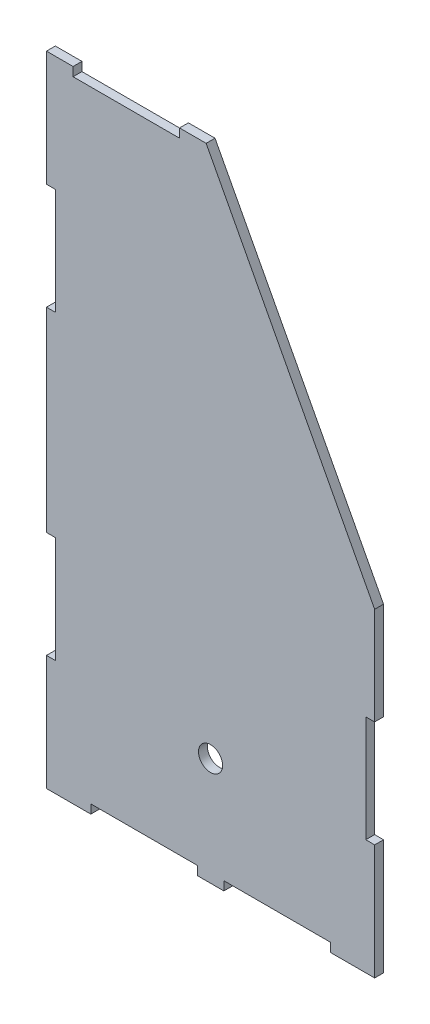
ISO-10303-21;
HEADER;
FILE_DESCRIPTION(('STEP AP214'),'2;1');
FILE_NAME('part.step','',(''),(''),'','','');
FILE_SCHEMA(('AUTOMOTIVE_DESIGN { 1 0 10303 214 1 1 1 1 }'));
ENDSEC;
DATA;
#1=APPLICATION_CONTEXT('core data for automotive mechanical design processes');
#2=APPLICATION_PROTOCOL_DEFINITION('international standard','automotive_design',2000,#1);
#3=PRODUCT_CONTEXT('',#1,'mechanical');
#4=PRODUCT('Part','Part','',(#3));
#5=PRODUCT_RELATED_PRODUCT_CATEGORY('part','',(#4));
#6=PRODUCT_DEFINITION_FORMATION('','',#4);
#7=PRODUCT_DEFINITION_CONTEXT('part definition',#1,'design');
#8=PRODUCT_DEFINITION('design','',#6,#7);
#9=PRODUCT_DEFINITION_SHAPE('','',#8);
#10=(LENGTH_UNIT() NAMED_UNIT(*) SI_UNIT(.MILLI.,.METRE.));
#11=(NAMED_UNIT(*) PLANE_ANGLE_UNIT() SI_UNIT($,.RADIAN.));
#12=(NAMED_UNIT(*) SI_UNIT($,.STERADIAN.) SOLID_ANGLE_UNIT());
#13=UNCERTAINTY_MEASURE_WITH_UNIT(LENGTH_MEASURE(1.E-05),#10,'distance_accuracy_value','');
#14=(GEOMETRIC_REPRESENTATION_CONTEXT(3) GLOBAL_UNCERTAINTY_ASSIGNED_CONTEXT((#13)) GLOBAL_UNIT_ASSIGNED_CONTEXT((#10,
#11,#12)) REPRESENTATION_CONTEXT('',''));
#15=CARTESIAN_POINT('',(0.,0.,0.));
#16=DIRECTION('',(0.,0.,1.));
#17=DIRECTION('',(1.,0.,0.));
#18=AXIS2_PLACEMENT_3D('',#15,#16,#17);
#19=CARTESIAN_POINT('',(321.219883672572,642.86985555023,6.35));
#20=DIRECTION('',(1.,0.,0.));
#21=DIRECTION('',(0.,0.,-1.));
#22=AXIS2_PLACEMENT_3D('',#19,#20,#21);
#23=PLANE('',#22);
#24=DIRECTION('',(0.,-1.,0.));
#25=VECTOR('',#24,1.);
#26=CARTESIAN_POINT('',(321.219883672572,642.86985555023,0.));
#27=LINE('',#26,#25);
#28=CARTESIAN_POINT('',(321.219883672572,484.11985555023,0.));
#29=VERTEX_POINT('',#28);
#30=CARTESIAN_POINT('',(321.219883672572,344.41985555023,0.));
#31=VERTEX_POINT('',#30);
#32=EDGE_CURVE('E249',#29,#31,#27,.T.);
#33=ORIENTED_EDGE('',*,*,#32,.T.);
#34=DIRECTION('',(0.,0.,1.));
#35=VECTOR('',#34,1.);
#36=CARTESIAN_POINT('',(321.219883672572,344.41985555023,0.));
#37=LINE('',#36,#35);
#38=CARTESIAN_POINT('',(321.219883672572,344.41985555023,6.35));
#39=VERTEX_POINT('',#38);
#40=EDGE_CURVE('E378',#31,#39,#37,.T.);
#41=ORIENTED_EDGE('',*,*,#40,.T.);
#42=DIRECTION('',(0.,-1.,0.));
#43=VECTOR('',#42,1.);
#44=CARTESIAN_POINT('',(321.219883672572,642.86985555023,6.35));
#45=LINE('',#44,#43);
#46=CARTESIAN_POINT('',(321.219883672572,484.11985555023,6.35));
#47=VERTEX_POINT('',#46);
#48=EDGE_CURVE('E414',#47,#39,#45,.T.);
#49=ORIENTED_EDGE('',*,*,#48,.F.);
#50=DIRECTION('',(0.,0.,1.));
#51=VECTOR('',#50,1.);
#52=CARTESIAN_POINT('',(321.219883672572,484.11985555023,0.));
#53=LINE('',#52,#51);
#54=EDGE_CURVE('E373',#29,#47,#53,.T.);
#55=ORIENTED_EDGE('',*,*,#54,.F.);
#56=EDGE_LOOP('',(#33,#41,#49,#55));
#57=FACE_BOUND('',#56,.T.);
#58=ADVANCED_FACE('F34',(#57),#23,.F.);
#59=CARTESIAN_POINT('',(321.219883672572,642.86985555023,0.));
#60=VERTEX_POINT('',#59);
#61=CARTESIAN_POINT('',(321.219883672572,560.31985555023,0.));
#62=VERTEX_POINT('',#61);
#63=EDGE_CURVE('E252',#60,#62,#27,.T.);
#64=ORIENTED_EDGE('',*,*,#63,.T.);
#65=DIRECTION('',(0.,0.,1.));
#66=VECTOR('',#65,1.);
#67=CARTESIAN_POINT('',(321.219883672572,560.31985555023,0.));
#68=LINE('',#67,#66);
#69=CARTESIAN_POINT('',(321.219883672572,560.31985555023,6.35));
#70=VERTEX_POINT('',#69);
#71=EDGE_CURVE('E349',#62,#70,#68,.T.);
#72=ORIENTED_EDGE('',*,*,#71,.T.);
#73=CARTESIAN_POINT('',(321.219883672572,642.86985555023,6.35));
#74=VERTEX_POINT('',#73);
#75=EDGE_CURVE('E410',#74,#70,#45,.T.);
#76=ORIENTED_EDGE('',*,*,#75,.F.);
#77=DIRECTION('',(0.,0.,-1.));
#78=VECTOR('',#77,1.);
#79=CARTESIAN_POINT('',(321.219883672572,642.86985555023,6.35));
#80=LINE('',#79,#78);
#81=EDGE_CURVE('E288',#74,#60,#80,.T.);
#82=ORIENTED_EDGE('',*,*,#81,.T.);
#83=EDGE_LOOP('',(#64,#72,#76,#82));
#84=FACE_BOUND('',#83,.T.);
#85=ADVANCED_FACE('F439',(#84),#23,.F.);
#86=CARTESIAN_POINT('',(321.219883672572,185.66985555023,6.35));
#87=DIRECTION('',(0.,1.,0.));
#88=DIRECTION('',(-1.,0.,0.));
#89=AXIS2_PLACEMENT_3D('',#86,#87,#88);
#90=PLANE('',#89);
#91=DIRECTION('',(1.,0.,0.));
#92=VECTOR('',#91,1.);
#93=CARTESIAN_POINT('',(321.219883672572,185.66985555023,0.));
#94=LINE('',#93,#92);
#95=CARTESIAN_POINT('',(321.219883672572,185.66985555023,0.));
#96=VERTEX_POINT('',#95);
#97=CARTESIAN_POINT('',(352.969883672572,185.66985555023,0.));
#98=VERTEX_POINT('',#97);
#99=EDGE_CURVE('E248',#96,#98,#94,.T.);
#100=ORIENTED_EDGE('',*,*,#99,.T.);
#101=DIRECTION('',(0.,0.,1.));
#102=VECTOR('',#101,1.);
#103=CARTESIAN_POINT('',(352.969883672572,185.66985555023,0.));
#104=LINE('',#103,#102);
#105=CARTESIAN_POINT('',(352.969883672572,185.66985555023,6.35));
#106=VERTEX_POINT('',#105);
#107=EDGE_CURVE('E462',#98,#106,#104,.T.);
#108=ORIENTED_EDGE('',*,*,#107,.T.);
#109=DIRECTION('',(1.,0.,0.));
#110=VECTOR('',#109,1.);
#111=CARTESIAN_POINT('',(321.219883672572,185.66985555023,6.35));
#112=LINE('',#111,#110);
#113=CARTESIAN_POINT('',(321.219883672572,185.66985555023,6.35));
#114=VERTEX_POINT('',#113);
#115=EDGE_CURVE('E415',#114,#106,#112,.T.);
#116=ORIENTED_EDGE('',*,*,#115,.F.);
#117=DIRECTION('',(0.,0.,-1.));
#118=VECTOR('',#117,1.);
#119=CARTESIAN_POINT('',(321.219883672572,185.66985555023,6.35));
#120=LINE('',#119,#118);
#121=EDGE_CURVE('E11',#114,#96,#120,.T.);
#122=ORIENTED_EDGE('',*,*,#121,.T.);
#123=EDGE_LOOP('',(#100,#108,#116,#122));
#124=FACE_BOUND('',#123,.T.);
#125=ADVANCED_FACE('F461',(#124),#90,.F.);
#126=CARTESIAN_POINT('',(429.169883672572,185.66985555023,6.35));
#127=VERTEX_POINT('',#126);
#128=CARTESIAN_POINT('',(448.219883672572,185.66985555023,6.35));
#129=VERTEX_POINT('',#128);
#130=EDGE_CURVE('E419',#127,#129,#112,.T.);
#131=ORIENTED_EDGE('',*,*,#130,.F.);
#132=DIRECTION('',(0.,0.,1.));
#133=VECTOR('',#132,1.);
#134=CARTESIAN_POINT('',(429.169883672572,185.66985555023,0.));
#135=LINE('',#134,#133);
#136=CARTESIAN_POINT('',(429.169883672572,185.66985555023,0.));
#137=VERTEX_POINT('',#136);
#138=EDGE_CURVE('E465',#137,#127,#135,.T.);
#139=ORIENTED_EDGE('',*,*,#138,.F.);
#140=CARTESIAN_POINT('',(448.219883672572,185.66985555023,0.));
#141=VERTEX_POINT('',#140);
#142=EDGE_CURVE('E264',#137,#141,#94,.T.);
#143=ORIENTED_EDGE('',*,*,#142,.T.);
#144=DIRECTION('',(0.,0.,1.));
#145=VECTOR('',#144,1.);
#146=CARTESIAN_POINT('',(448.219883672572,185.66985555023,0.));
#147=LINE('',#146,#145);
#148=EDGE_CURVE('E345',#141,#129,#147,.T.);
#149=ORIENTED_EDGE('',*,*,#148,.T.);
#150=EDGE_LOOP('',(#131,#139,#143,#149));
#151=FACE_BOUND('',#150,.T.);
#152=ADVANCED_FACE('F526',(#151),#90,.F.);
#153=CARTESIAN_POINT('',(556.169883672572,414.26985555023,6.35));
#154=DIRECTION('',(-1.,0.,0.));
#155=DIRECTION('',(0.,-1.,0.));
#156=AXIS2_PLACEMENT_3D('',#153,#154,#155);
#157=PLANE('',#156);
#158=DIRECTION('',(0.,1.,0.));
#159=VECTOR('',#158,1.);
#160=CARTESIAN_POINT('',(556.169883672572,414.26985555023,6.35));
#161=LINE('',#160,#159);
#162=CARTESIAN_POINT('',(556.169883672572,344.41985555023,6.35));
#163=VERTEX_POINT('',#162);
#164=CARTESIAN_POINT('',(556.169883672572,414.26985555023,6.35));
#165=VERTEX_POINT('',#164);
#166=EDGE_CURVE('E418',#163,#165,#161,.T.);
#167=ORIENTED_EDGE('',*,*,#166,.F.);
#168=DIRECTION('',(0.,0.,1.));
#169=VECTOR('',#168,1.);
#170=CARTESIAN_POINT('',(556.169883672572,344.41985555023,0.));
#171=LINE('',#170,#169);
#172=CARTESIAN_POINT('',(556.169883672572,344.41985555023,0.));
#173=VERTEX_POINT('',#172);
#174=EDGE_CURVE('E331',#173,#163,#171,.T.);
#175=ORIENTED_EDGE('',*,*,#174,.F.);
#176=DIRECTION('',(0.,1.,0.));
#177=VECTOR('',#176,1.);
#178=CARTESIAN_POINT('',(556.169883672572,414.26985555023,0.));
#179=LINE('',#178,#177);
#180=CARTESIAN_POINT('',(556.169883672572,414.26985555023,0.));
#181=VERTEX_POINT('',#180);
#182=EDGE_CURVE('E272',#173,#181,#179,.T.);
#183=ORIENTED_EDGE('',*,*,#182,.T.);
#184=DIRECTION('',(0.,0.,-1.));
#185=VECTOR('',#184,1.);
#186=CARTESIAN_POINT('',(556.169883672572,414.26985555023,6.35));
#187=LINE('',#186,#185);
#188=EDGE_CURVE('E294',#165,#181,#187,.T.);
#189=ORIENTED_EDGE('',*,*,#188,.F.);
#190=EDGE_LOOP('',(#167,#175,#183,#189));
#191=FACE_BOUND('',#190,.T.);
#192=ADVANCED_FACE('F527',(#191),#157,.F.);
#193=CARTESIAN_POINT('',(321.219883672572,642.86985555023,6.35));
#194=DIRECTION('',(0.,-1.,0.));
#195=DIRECTION('',(0.,0.,-1.));
#196=AXIS2_PLACEMENT_3D('',#193,#194,#195);
#197=PLANE('',#196);
#198=DIRECTION('',(-1.,0.,0.));
#199=VECTOR('',#198,1.);
#200=CARTESIAN_POINT('',(321.219883672572,642.86985555023,0.));
#201=LINE('',#200,#199);
#202=CARTESIAN_POINT('',(435.519883672572,642.86985555023,0.));
#203=VERTEX_POINT('',#202);
#204=CARTESIAN_POINT('',(416.469883672572,642.86985555023,0.));
#205=VERTEX_POINT('',#204);
#206=EDGE_CURVE('E285',#203,#205,#201,.T.);
#207=ORIENTED_EDGE('',*,*,#206,.T.);
#208=DIRECTION('',(0.,0.,1.));
#209=VECTOR('',#208,1.);
#210=CARTESIAN_POINT('',(416.469883672572,642.86985555023,0.));
#211=LINE('',#210,#209);
#212=CARTESIAN_POINT('',(416.469883672572,642.86985555023,6.35));
#213=VERTEX_POINT('',#212);
#214=EDGE_CURVE('E398',#205,#213,#211,.T.);
#215=ORIENTED_EDGE('',*,*,#214,.T.);
#216=DIRECTION('',(-1.,0.,0.));
#217=VECTOR('',#216,1.);
#218=CARTESIAN_POINT('',(321.219883672572,642.86985555023,6.35));
#219=LINE('',#218,#217);
#220=CARTESIAN_POINT('',(435.519883672572,642.86985555023,6.35));
#221=VERTEX_POINT('',#220);
#222=EDGE_CURVE('E291',#221,#213,#219,.T.);
#223=ORIENTED_EDGE('',*,*,#222,.F.);
#224=DIRECTION('',(0.,0.,-1.));
#225=VECTOR('',#224,1.);
#226=CARTESIAN_POINT('',(435.519883672572,642.86985555023,6.35));
#227=LINE('',#226,#225);
#228=EDGE_CURVE('E290',#221,#203,#227,.T.);
#229=ORIENTED_EDGE('',*,*,#228,.T.);
#230=EDGE_LOOP('',(#207,#215,#223,#229));
#231=FACE_BOUND('',#230,.T.);
#232=ADVANCED_FACE('F521',(#231),#197,.F.);
#233=CARTESIAN_POINT('',(321.219883672572,268.21985555023,6.35));
#234=VERTEX_POINT('',#233);
#235=EDGE_CURVE('E241',#234,#114,#45,.T.);
#236=ORIENTED_EDGE('',*,*,#235,.F.);
#237=DIRECTION('',(0.,0.,1.));
#238=VECTOR('',#237,1.);
#239=CARTESIAN_POINT('',(321.219883672572,268.21985555023,0.));
#240=LINE('',#239,#238);
#241=CARTESIAN_POINT('',(321.219883672572,268.21985555023,0.));
#242=VERTEX_POINT('',#241);
#243=EDGE_CURVE('E229',#242,#234,#240,.T.);
#244=ORIENTED_EDGE('',*,*,#243,.F.);
#245=EDGE_CURVE('E239',#242,#96,#27,.T.);
#246=ORIENTED_EDGE('',*,*,#245,.T.);
#247=ORIENTED_EDGE('',*,*,#121,.F.);
#248=EDGE_LOOP('',(#236,#244,#246,#247));
#249=FACE_BOUND('',#248,.T.);
#250=ADVANCED_FACE('F36',(#249),#23,.F.);
#251=CARTESIAN_POINT('',(524.419883672572,185.66985555023,6.35));
#252=VERTEX_POINT('',#251);
#253=CARTESIAN_POINT('',(556.169883672572,185.66985555023,6.35));
#254=VERTEX_POINT('',#253);
#255=EDGE_CURVE('E413',#252,#254,#112,.T.);
#256=ORIENTED_EDGE('',*,*,#255,.F.);
#257=DIRECTION('',(0.,0.,1.));
#258=VECTOR('',#257,1.);
#259=CARTESIAN_POINT('',(524.419883672572,185.66985555023,0.));
#260=LINE('',#259,#258);
#261=CARTESIAN_POINT('',(524.419883672572,185.66985555023,0.));
#262=VERTEX_POINT('',#261);
#263=EDGE_CURVE('E359',#262,#252,#260,.T.);
#264=ORIENTED_EDGE('',*,*,#263,.F.);
#265=CARTESIAN_POINT('',(556.169883672572,185.66985555023,0.));
#266=VERTEX_POINT('',#265);
#267=EDGE_CURVE('E259',#262,#266,#94,.T.);
#268=ORIENTED_EDGE('',*,*,#267,.T.);
#269=DIRECTION('',(0.,0.,-1.));
#270=VECTOR('',#269,1.);
#271=CARTESIAN_POINT('',(556.169883672572,185.66985555023,6.35));
#272=LINE('',#271,#270);
#273=EDGE_CURVE('E43',#254,#266,#272,.T.);
#274=ORIENTED_EDGE('',*,*,#273,.F.);
#275=EDGE_LOOP('',(#256,#264,#268,#274));
#276=FACE_BOUND('',#275,.T.);
#277=ADVANCED_FACE('F520',(#276),#90,.F.);
#278=CARTESIAN_POINT('',(556.169883672572,268.21985555023,0.));
#279=VERTEX_POINT('',#278);
#280=EDGE_CURVE('E275',#266,#279,#179,.T.);
#281=ORIENTED_EDGE('',*,*,#280,.T.);
#282=DIRECTION('',(0.,0.,1.));
#283=VECTOR('',#282,1.);
#284=CARTESIAN_POINT('',(556.169883672572,268.21985555023,0.));
#285=LINE('',#284,#283);
#286=CARTESIAN_POINT('',(556.169883672572,268.21985555023,6.35));
#287=VERTEX_POINT('',#286);
#288=EDGE_CURVE('E333',#279,#287,#285,.T.);
#289=ORIENTED_EDGE('',*,*,#288,.T.);
#290=EDGE_CURVE('E302',#254,#287,#161,.T.);
#291=ORIENTED_EDGE('',*,*,#290,.F.);
#292=ORIENTED_EDGE('',*,*,#273,.T.);
#293=EDGE_LOOP('',(#281,#289,#291,#292));
#294=FACE_BOUND('',#293,.T.);
#295=ADVANCED_FACE('F299',(#294),#157,.F.);
#296=CARTESIAN_POINT('',(435.519883672572,642.86985555023,6.35));
#297=DIRECTION('',(-0.884384752846969,-0.466758619558123,0.));
#298=DIRECTION('',(0.466758619558123,-0.884384752846969,0.));
#299=AXIS2_PLACEMENT_3D('',#296,#297,#298);
#300=PLANE('',#299);
#301=DIRECTION('',(-0.466758619558123,0.884384752846969,0.));
#302=VECTOR('',#301,1.);
#303=CARTESIAN_POINT('',(435.519883672572,642.86985555023,0.));
#304=LINE('',#303,#302);
#305=EDGE_CURVE('E281',#181,#203,#304,.T.);
#306=ORIENTED_EDGE('',*,*,#305,.T.);
#307=ORIENTED_EDGE('',*,*,#228,.F.);
#308=DIRECTION('',(-0.466758619558123,0.884384752846969,0.));
#309=VECTOR('',#308,1.);
#310=CARTESIAN_POINT('',(435.519883672572,642.86985555023,6.35));
#311=LINE('',#310,#309);
#312=EDGE_CURVE('E421',#165,#221,#311,.T.);
#313=ORIENTED_EDGE('',*,*,#312,.F.);
#314=ORIENTED_EDGE('',*,*,#188,.T.);
#315=EDGE_LOOP('',(#306,#307,#313,#314));
#316=FACE_BOUND('',#315,.T.);
#317=ADVANCED_FACE('F537',(#316),#300,.F.);
#318=CARTESIAN_POINT('',(340.269883672572,642.86985555023,6.35));
#319=VERTEX_POINT('',#318);
#320=EDGE_CURVE('E422',#319,#74,#219,.T.);
#321=ORIENTED_EDGE('',*,*,#320,.F.);
#322=DIRECTION('',(0.,0.,1.));
#323=VECTOR('',#322,1.);
#324=CARTESIAN_POINT('',(340.269883672572,642.86985555023,0.));
#325=LINE('',#324,#323);
#326=CARTESIAN_POINT('',(340.269883672572,642.86985555023,0.));
#327=VERTEX_POINT('',#326);
#328=EDGE_CURVE('E406',#327,#319,#325,.T.);
#329=ORIENTED_EDGE('',*,*,#328,.F.);
#330=EDGE_CURVE('E284',#327,#60,#201,.T.);
#331=ORIENTED_EDGE('',*,*,#330,.T.);
#332=ORIENTED_EDGE('',*,*,#81,.F.);
#333=EDGE_LOOP('',(#321,#329,#331,#332));
#334=FACE_BOUND('',#333,.T.);
#335=ADVANCED_FACE('F437',(#334),#197,.F.);
#336=CARTESIAN_POINT('',(0.,0.,6.35));
#337=DIRECTION('',(0.,0.,1.));
#338=DIRECTION('',(1.,0.,0.));
#339=AXIS2_PLACEMENT_3D('',#336,#337,#338);
#340=PLANE('',#339);
#341=CARTESIAN_POINT('',(438.694883672572,262.989065336249,6.35));
#342=DIRECTION('',(0.,0.,1.));
#343=DIRECTION('',(1.,0.,0.));
#344=AXIS2_PLACEMENT_3D('',#341,#342,#343);
#345=CIRCLE('',#344,8.63599999999998);
#346=CARTESIAN_POINT('',(447.330883672572,262.989065336249,6.35));
#347=VERTEX_POINT('',#346);
#348=EDGE_CURVE('E497',#347,#347,#345,.T.);
#349=ORIENTED_EDGE('',*,*,#348,.F.);
#350=EDGE_LOOP('',(#349));
#351=FACE_BOUND('',#350,.T.);
#352=DIRECTION('',(-1.,0.,0.));
#353=VECTOR('',#352,1.);
#354=CARTESIAN_POINT('',(549.819883672572,344.41985555023,6.35));
#355=LINE('',#354,#353);
#356=CARTESIAN_POINT('',(549.819883672572,344.41985555023,6.35));
#357=VERTEX_POINT('',#356);
#358=EDGE_CURVE('E317',#163,#357,#355,.T.);
#359=ORIENTED_EDGE('',*,*,#358,.F.);
#360=ORIENTED_EDGE('',*,*,#166,.T.);
#361=ORIENTED_EDGE('',*,*,#312,.T.);
#362=ORIENTED_EDGE('',*,*,#222,.T.);
#363=DIRECTION('',(0.,1.,0.));
#364=VECTOR('',#363,1.);
#365=CARTESIAN_POINT('',(416.469883672572,642.86985555023,6.35));
#366=LINE('',#365,#364);
#367=CARTESIAN_POINT('',(416.469883672572,636.51985555023,6.35));
#368=VERTEX_POINT('',#367);
#369=EDGE_CURVE('E356',#368,#213,#366,.T.);
#370=ORIENTED_EDGE('',*,*,#369,.F.);
#371=DIRECTION('',(1.,0.,0.));
#372=VECTOR('',#371,1.);
#373=CARTESIAN_POINT('',(416.469883672572,636.51985555023,6.35));
#374=LINE('',#373,#372);
#375=CARTESIAN_POINT('',(340.269883672572,636.51985555023,6.35));
#376=VERTEX_POINT('',#375);
#377=EDGE_CURVE('E392',#376,#368,#374,.T.);
#378=ORIENTED_EDGE('',*,*,#377,.F.);
#379=DIRECTION('',(0.,-1.,0.));
#380=VECTOR('',#379,1.);
#381=CARTESIAN_POINT('',(340.269883672572,642.86985555023,6.35));
#382=LINE('',#381,#380);
#383=EDGE_CURVE('E400',#319,#376,#382,.T.);
#384=ORIENTED_EDGE('',*,*,#383,.F.);
#385=ORIENTED_EDGE('',*,*,#320,.T.);
#386=ORIENTED_EDGE('',*,*,#75,.T.);
#387=DIRECTION('',(-1.,0.,0.));
#388=VECTOR('',#387,1.);
#389=CARTESIAN_POINT('',(321.219883672572,560.31985555023,6.35));
#390=LINE('',#389,#388);
#391=CARTESIAN_POINT('',(327.569883672572,560.31985555023,6.35));
#392=VERTEX_POINT('',#391);
#393=EDGE_CURVE('E367',#392,#70,#390,.T.);
#394=ORIENTED_EDGE('',*,*,#393,.F.);
#395=DIRECTION('',(0.,1.,0.));
#396=VECTOR('',#395,1.);
#397=CARTESIAN_POINT('',(327.569883672572,560.31985555023,6.35));
#398=LINE('',#397,#396);
#399=CARTESIAN_POINT('',(327.569883672572,484.11985555023,6.35));
#400=VERTEX_POINT('',#399);
#401=EDGE_CURVE('E377',#400,#392,#398,.T.);
#402=ORIENTED_EDGE('',*,*,#401,.F.);
#403=DIRECTION('',(1.,0.,0.));
#404=VECTOR('',#403,1.);
#405=CARTESIAN_POINT('',(321.219883672572,484.11985555023,6.35));
#406=LINE('',#405,#404);
#407=EDGE_CURVE('E374',#47,#400,#406,.T.);
#408=ORIENTED_EDGE('',*,*,#407,.F.);
#409=ORIENTED_EDGE('',*,*,#48,.T.);
#410=DIRECTION('',(-1.,0.,0.));
#411=VECTOR('',#410,1.);
#412=CARTESIAN_POINT('',(321.219883672572,344.41985555023,6.35));
#413=LINE('',#412,#411);
#414=CARTESIAN_POINT('',(327.569883672572,344.41985555023,6.35));
#415=VERTEX_POINT('',#414);
#416=EDGE_CURVE('E234',#415,#39,#413,.T.);
#417=ORIENTED_EDGE('',*,*,#416,.F.);
#418=DIRECTION('',(0.,1.,0.));
#419=VECTOR('',#418,1.);
#420=CARTESIAN_POINT('',(327.569883672572,344.41985555023,6.35));
#421=LINE('',#420,#419);
#422=CARTESIAN_POINT('',(327.569883672572,268.21985555023,6.35));
#423=VERTEX_POINT('',#422);
#424=EDGE_CURVE('E490',#423,#415,#421,.T.);
#425=ORIENTED_EDGE('',*,*,#424,.F.);
#426=DIRECTION('',(1.,0.,0.));
#427=VECTOR('',#426,1.);
#428=CARTESIAN_POINT('',(321.219883672572,268.21985555023,6.35));
#429=LINE('',#428,#427);
#430=EDGE_CURVE('E460',#234,#423,#429,.T.);
#431=ORIENTED_EDGE('',*,*,#430,.F.);
#432=ORIENTED_EDGE('',*,*,#235,.T.);
#433=ORIENTED_EDGE('',*,*,#115,.T.);
#434=DIRECTION('',(0.,-1.,0.));
#435=VECTOR('',#434,1.);
#436=CARTESIAN_POINT('',(352.969883672572,192.01985555023,6.35));
#437=LINE('',#436,#435);
#438=CARTESIAN_POINT('',(352.969883672572,192.01985555023,6.35));
#439=VERTEX_POINT('',#438);
#440=EDGE_CURVE('E330',#439,#106,#437,.T.);
#441=ORIENTED_EDGE('',*,*,#440,.F.);
#442=DIRECTION('',(-1.,0.,0.));
#443=VECTOR('',#442,1.);
#444=CARTESIAN_POINT('',(352.969883672572,192.01985555023,6.35));
#445=LINE('',#444,#443);
#446=CARTESIAN_POINT('',(429.169883672572,192.01985555023,6.35));
#447=VERTEX_POINT('',#446);
#448=EDGE_CURVE('E474',#447,#439,#445,.T.);
#449=ORIENTED_EDGE('',*,*,#448,.F.);
#450=DIRECTION('',(0.,1.,0.));
#451=VECTOR('',#450,1.);
#452=CARTESIAN_POINT('',(429.169883672572,192.01985555023,6.35));
#453=LINE('',#452,#451);
#454=EDGE_CURVE('E478',#127,#447,#453,.T.);
#455=ORIENTED_EDGE('',*,*,#454,.F.);
#456=ORIENTED_EDGE('',*,*,#130,.T.);
#457=DIRECTION('',(0.,-1.,0.));
#458=VECTOR('',#457,1.);
#459=CARTESIAN_POINT('',(448.219883672572,192.01985555023,6.35));
#460=LINE('',#459,#458);
#461=CARTESIAN_POINT('',(448.219883672572,192.01985555023,6.35));
#462=VERTEX_POINT('',#461);
#463=EDGE_CURVE('E346',#462,#129,#460,.T.);
#464=ORIENTED_EDGE('',*,*,#463,.F.);
#465=DIRECTION('',(-1.,0.,0.));
#466=VECTOR('',#465,1.);
#467=CARTESIAN_POINT('',(448.219883672572,192.01985555023,6.35));
#468=LINE('',#467,#466);
#469=CARTESIAN_POINT('',(524.419883672572,192.01985555023,6.35));
#470=VERTEX_POINT('',#469);
#471=EDGE_CURVE('E340',#470,#462,#468,.T.);
#472=ORIENTED_EDGE('',*,*,#471,.F.);
#473=DIRECTION('',(0.,1.,0.));
#474=VECTOR('',#473,1.);
#475=CARTESIAN_POINT('',(524.419883672572,192.01985555023,6.35));
#476=LINE('',#475,#474);
#477=EDGE_CURVE('E348',#252,#470,#476,.T.);
#478=ORIENTED_EDGE('',*,*,#477,.F.);
#479=ORIENTED_EDGE('',*,*,#255,.T.);
#480=ORIENTED_EDGE('',*,*,#290,.T.);
#481=DIRECTION('',(1.,0.,0.));
#482=VECTOR('',#481,1.);
#483=CARTESIAN_POINT('',(549.819883672572,268.21985555023,6.35));
#484=LINE('',#483,#482);
#485=CARTESIAN_POINT('',(549.819883672572,268.21985555023,6.35));
#486=VERTEX_POINT('',#485);
#487=EDGE_CURVE('E324',#486,#287,#484,.T.);
#488=ORIENTED_EDGE('',*,*,#487,.F.);
#489=DIRECTION('',(0.,-1.,0.));
#490=VECTOR('',#489,1.);
#491=CARTESIAN_POINT('',(549.819883672572,344.41985555023,6.35));
#492=LINE('',#491,#490);
#493=EDGE_CURVE('E321',#357,#486,#492,.T.);
#494=ORIENTED_EDGE('',*,*,#493,.F.);
#495=EDGE_LOOP('',(#359,#360,#361,#362,#370,#378,#384,#385,#386,#394,#402,#408,#409,#417,#425,
#431,#432,#433,#441,#449,#455,#456,#464,#472,#478,#479,#480,#488,#494));
#496=FACE_BOUND('',#495,.T.);
#497=ADVANCED_FACE('F431',(#351,#496),#340,.T.);
#498=CARTESIAN_POINT('',(0.,0.,0.));
#499=DIRECTION('',(0.,0.,1.));
#500=DIRECTION('',(1.,0.,0.));
#501=AXIS2_PLACEMENT_3D('',#498,#499,#500);
#502=PLANE('',#501);
#503=CARTESIAN_POINT('',(438.694883672572,262.989065336249,0.));
#504=DIRECTION('',(0.,0.,1.));
#505=DIRECTION('',(1.,0.,0.));
#506=AXIS2_PLACEMENT_3D('',#503,#504,#505);
#507=CIRCLE('',#506,8.63599999999998);
#508=CARTESIAN_POINT('',(447.330883672572,262.989065336249,0.));
#509=VERTEX_POINT('',#508);
#510=EDGE_CURVE('E38',#509,#509,#507,.T.);
#511=ORIENTED_EDGE('',*,*,#510,.T.);
#512=EDGE_LOOP('',(#511));
#513=FACE_BOUND('',#512,.T.);
#514=ORIENTED_EDGE('',*,*,#182,.F.);
#515=DIRECTION('',(-1.,0.,0.));
#516=VECTOR('',#515,1.);
#517=CARTESIAN_POINT('',(549.819883672572,344.41985555023,0.));
#518=LINE('',#517,#516);
#519=CARTESIAN_POINT('',(549.819883672572,344.41985555023,0.));
#520=VERTEX_POINT('',#519);
#521=EDGE_CURVE('E313',#173,#520,#518,.T.);
#522=ORIENTED_EDGE('',*,*,#521,.T.);
#523=DIRECTION('',(0.,-1.,0.));
#524=VECTOR('',#523,1.);
#525=CARTESIAN_POINT('',(549.819883672572,344.41985555023,0.));
#526=LINE('',#525,#524);
#527=CARTESIAN_POINT('',(549.819883672572,268.21985555023,0.));
#528=VERTEX_POINT('',#527);
#529=EDGE_CURVE('E311',#520,#528,#526,.T.);
#530=ORIENTED_EDGE('',*,*,#529,.T.);
#531=DIRECTION('',(1.,0.,0.));
#532=VECTOR('',#531,1.);
#533=CARTESIAN_POINT('',(549.819883672572,268.21985555023,0.));
#534=LINE('',#533,#532);
#535=EDGE_CURVE('E308',#528,#279,#534,.T.);
#536=ORIENTED_EDGE('',*,*,#535,.T.);
#537=ORIENTED_EDGE('',*,*,#280,.F.);
#538=ORIENTED_EDGE('',*,*,#267,.F.);
#539=DIRECTION('',(0.,1.,0.));
#540=VECTOR('',#539,1.);
#541=CARTESIAN_POINT('',(524.419883672572,192.01985555023,0.));
#542=LINE('',#541,#540);
#543=CARTESIAN_POINT('',(524.419883672572,192.01985555023,0.));
#544=VERTEX_POINT('',#543);
#545=EDGE_CURVE('E339',#262,#544,#542,.T.);
#546=ORIENTED_EDGE('',*,*,#545,.T.);
#547=DIRECTION('',(-1.,0.,0.));
#548=VECTOR('',#547,1.);
#549=CARTESIAN_POINT('',(448.219883672572,192.01985555023,0.));
#550=LINE('',#549,#548);
#551=CARTESIAN_POINT('',(448.219883672572,192.01985555023,0.));
#552=VERTEX_POINT('',#551);
#553=EDGE_CURVE('E342',#544,#552,#550,.T.);
#554=ORIENTED_EDGE('',*,*,#553,.T.);
#555=DIRECTION('',(0.,-1.,0.));
#556=VECTOR('',#555,1.);
#557=CARTESIAN_POINT('',(448.219883672572,192.01985555023,0.));
#558=LINE('',#557,#556);
#559=EDGE_CURVE('E336',#552,#141,#558,.T.);
#560=ORIENTED_EDGE('',*,*,#559,.T.);
#561=ORIENTED_EDGE('',*,*,#142,.F.);
#562=DIRECTION('',(0.,1.,0.));
#563=VECTOR('',#562,1.);
#564=CARTESIAN_POINT('',(429.169883672572,192.01985555023,0.));
#565=LINE('',#564,#563);
#566=CARTESIAN_POINT('',(429.169883672572,192.01985555023,0.));
#567=VERTEX_POINT('',#566);
#568=EDGE_CURVE('E468',#137,#567,#565,.T.);
#569=ORIENTED_EDGE('',*,*,#568,.T.);
#570=DIRECTION('',(-1.,0.,0.));
#571=VECTOR('',#570,1.);
#572=CARTESIAN_POINT('',(352.969883672572,192.01985555023,0.));
#573=LINE('',#572,#571);
#574=CARTESIAN_POINT('',(352.969883672572,192.01985555023,0.));
#575=VERTEX_POINT('',#574);
#576=EDGE_CURVE('E50',#567,#575,#573,.T.);
#577=ORIENTED_EDGE('',*,*,#576,.T.);
#578=DIRECTION('',(0.,-1.,0.));
#579=VECTOR('',#578,1.);
#580=CARTESIAN_POINT('',(352.969883672572,192.01985555023,0.));
#581=LINE('',#580,#579);
#582=EDGE_CURVE('E477',#575,#98,#581,.T.);
#583=ORIENTED_EDGE('',*,*,#582,.T.);
#584=ORIENTED_EDGE('',*,*,#99,.F.);
#585=ORIENTED_EDGE('',*,*,#245,.F.);
#586=DIRECTION('',(1.,0.,0.));
#587=VECTOR('',#586,1.);
#588=CARTESIAN_POINT('',(321.219883672572,268.21985555023,0.));
#589=LINE('',#588,#587);
#590=CARTESIAN_POINT('',(327.569883672572,268.21985555023,0.));
#591=VERTEX_POINT('',#590);
#592=EDGE_CURVE('E225',#242,#591,#589,.T.);
#593=ORIENTED_EDGE('',*,*,#592,.T.);
#594=DIRECTION('',(0.,1.,0.));
#595=VECTOR('',#594,1.);
#596=CARTESIAN_POINT('',(327.569883672572,344.41985555023,0.));
#597=LINE('',#596,#595);
#598=CARTESIAN_POINT('',(327.569883672572,344.41985555023,0.));
#599=VERTEX_POINT('',#598);
#600=EDGE_CURVE('E58',#591,#599,#597,.T.);
#601=ORIENTED_EDGE('',*,*,#600,.T.);
#602=DIRECTION('',(-1.,0.,0.));
#603=VECTOR('',#602,1.);
#604=CARTESIAN_POINT('',(321.219883672572,344.41985555023,0.));
#605=LINE('',#604,#603);
#606=EDGE_CURVE('E242',#599,#31,#605,.T.);
#607=ORIENTED_EDGE('',*,*,#606,.T.);
#608=ORIENTED_EDGE('',*,*,#32,.F.);
#609=DIRECTION('',(1.,0.,0.));
#610=VECTOR('',#609,1.);
#611=CARTESIAN_POINT('',(321.219883672572,484.11985555023,0.));
#612=LINE('',#611,#610);
#613=CARTESIAN_POINT('',(327.569883672572,484.11985555023,0.));
#614=VERTEX_POINT('',#613);
#615=EDGE_CURVE('E363',#29,#614,#612,.T.);
#616=ORIENTED_EDGE('',*,*,#615,.T.);
#617=DIRECTION('',(0.,1.,0.));
#618=VECTOR('',#617,1.);
#619=CARTESIAN_POINT('',(327.569883672572,560.31985555023,0.));
#620=LINE('',#619,#618);
#621=CARTESIAN_POINT('',(327.569883672572,560.31985555023,0.));
#622=VERTEX_POINT('',#621);
#623=EDGE_CURVE('E366',#614,#622,#620,.T.);
#624=ORIENTED_EDGE('',*,*,#623,.T.);
#625=DIRECTION('',(-1.,0.,0.));
#626=VECTOR('',#625,1.);
#627=CARTESIAN_POINT('',(321.219883672572,560.31985555023,0.));
#628=LINE('',#627,#626);
#629=EDGE_CURVE('E370',#622,#62,#628,.T.);
#630=ORIENTED_EDGE('',*,*,#629,.T.);
#631=ORIENTED_EDGE('',*,*,#63,.F.);
#632=ORIENTED_EDGE('',*,*,#330,.F.);
#633=DIRECTION('',(0.,-1.,0.));
#634=VECTOR('',#633,1.);
#635=CARTESIAN_POINT('',(340.269883672572,642.86985555023,0.));
#636=LINE('',#635,#634);
#637=CARTESIAN_POINT('',(340.269883672572,636.51985555023,0.));
#638=VERTEX_POINT('',#637);
#639=EDGE_CURVE('E391',#327,#638,#636,.T.);
#640=ORIENTED_EDGE('',*,*,#639,.T.);
#641=DIRECTION('',(1.,0.,0.));
#642=VECTOR('',#641,1.);
#643=CARTESIAN_POINT('',(416.469883672572,636.51985555023,0.));
#644=LINE('',#643,#642);
#645=CARTESIAN_POINT('',(416.469883672572,636.51985555023,0.));
#646=VERTEX_POINT('',#645);
#647=EDGE_CURVE('E395',#638,#646,#644,.T.);
#648=ORIENTED_EDGE('',*,*,#647,.T.);
#649=DIRECTION('',(0.,1.,0.));
#650=VECTOR('',#649,1.);
#651=CARTESIAN_POINT('',(416.469883672572,642.86985555023,0.));
#652=LINE('',#651,#650);
#653=EDGE_CURVE('E388',#646,#205,#652,.T.);
#654=ORIENTED_EDGE('',*,*,#653,.T.);
#655=ORIENTED_EDGE('',*,*,#206,.F.);
#656=ORIENTED_EDGE('',*,*,#305,.F.);
#657=EDGE_LOOP('',(#514,#522,#530,#536,#537,#538,#546,#554,#560,#561,#569,#577,#583,#584,#585,
#593,#601,#607,#608,#616,#624,#630,#631,#632,#640,#648,#654,#655,#656));
#658=FACE_BOUND('',#657,.T.);
#659=ADVANCED_FACE('F245',(#513,#658),#502,.F.);
#660=CARTESIAN_POINT('',(416.469883672572,642.86985555023,0.));
#661=DIRECTION('',(1.,0.,0.));
#662=DIRECTION('',(0.,0.,-1.));
#663=AXIS2_PLACEMENT_3D('',#660,#661,#662);
#664=PLANE('',#663);
#665=ORIENTED_EDGE('',*,*,#369,.T.);
#666=ORIENTED_EDGE('',*,*,#214,.F.);
#667=ORIENTED_EDGE('',*,*,#653,.F.);
#668=DIRECTION('',(0.,0.,1.));
#669=VECTOR('',#668,1.);
#670=CARTESIAN_POINT('',(416.469883672572,636.51985555023,0.));
#671=LINE('',#670,#669);
#672=EDGE_CURVE('E250',#646,#368,#671,.T.);
#673=ORIENTED_EDGE('',*,*,#672,.T.);
#674=EDGE_LOOP('',(#665,#666,#667,#673));
#675=FACE_BOUND('',#674,.T.);
#676=ADVANCED_FACE('F555',(#675),#664,.F.);
#677=CARTESIAN_POINT('',(416.469883672572,636.51985555023,0.));
#678=DIRECTION('',(0.,-1.,0.));
#679=DIRECTION('',(1.,0.,0.));
#680=AXIS2_PLACEMENT_3D('',#677,#678,#679);
#681=PLANE('',#680);
#682=ORIENTED_EDGE('',*,*,#377,.T.);
#683=ORIENTED_EDGE('',*,*,#672,.F.);
#684=ORIENTED_EDGE('',*,*,#647,.F.);
#685=DIRECTION('',(0.,0.,1.));
#686=VECTOR('',#685,1.);
#687=CARTESIAN_POINT('',(340.269883672572,636.51985555023,0.));
#688=LINE('',#687,#686);
#689=EDGE_CURVE('E254',#638,#376,#688,.T.);
#690=ORIENTED_EDGE('',*,*,#689,.T.);
#691=EDGE_LOOP('',(#682,#683,#684,#690));
#692=FACE_BOUND('',#691,.T.);
#693=ADVANCED_FACE('F557',(#692),#681,.F.);
#694=CARTESIAN_POINT('',(340.269883672572,642.86985555023,0.));
#695=DIRECTION('',(-1.,0.,0.));
#696=DIRECTION('',(0.,0.,1.));
#697=AXIS2_PLACEMENT_3D('',#694,#695,#696);
#698=PLANE('',#697);
#699=ORIENTED_EDGE('',*,*,#383,.T.);
#700=ORIENTED_EDGE('',*,*,#689,.F.);
#701=ORIENTED_EDGE('',*,*,#639,.F.);
#702=ORIENTED_EDGE('',*,*,#328,.T.);
#703=EDGE_LOOP('',(#699,#700,#701,#702));
#704=FACE_BOUND('',#703,.T.);
#705=ADVANCED_FACE('F560',(#704),#698,.F.);
#706=CARTESIAN_POINT('',(448.219883672572,192.01985555023,0.));
#707=DIRECTION('',(-1.,0.,0.));
#708=DIRECTION('',(0.,0.,1.));
#709=AXIS2_PLACEMENT_3D('',#706,#707,#708);
#710=PLANE('',#709);
#711=ORIENTED_EDGE('',*,*,#463,.T.);
#712=ORIENTED_EDGE('',*,*,#148,.F.);
#713=ORIENTED_EDGE('',*,*,#559,.F.);
#714=DIRECTION('',(0.,0.,1.));
#715=VECTOR('',#714,1.);
#716=CARTESIAN_POINT('',(448.219883672572,192.01985555023,0.));
#717=LINE('',#716,#715);
#718=EDGE_CURVE('E354',#552,#462,#717,.T.);
#719=ORIENTED_EDGE('',*,*,#718,.T.);
#720=EDGE_LOOP('',(#711,#712,#713,#719));
#721=FACE_BOUND('',#720,.T.);
#722=ADVANCED_FACE('F562',(#721),#710,.F.);
#723=CARTESIAN_POINT('',(448.219883672572,192.01985555023,0.));
#724=DIRECTION('',(0.,1.,0.));
#725=DIRECTION('',(0.,0.,1.));
#726=AXIS2_PLACEMENT_3D('',#723,#724,#725);
#727=PLANE('',#726);
#728=ORIENTED_EDGE('',*,*,#471,.T.);
#729=ORIENTED_EDGE('',*,*,#718,.F.);
#730=ORIENTED_EDGE('',*,*,#553,.F.);
#731=DIRECTION('',(0.,0.,1.));
#732=VECTOR('',#731,1.);
#733=CARTESIAN_POINT('',(524.419883672572,192.01985555023,0.));
#734=LINE('',#733,#732);
#735=EDGE_CURVE('E357',#544,#470,#734,.T.);
#736=ORIENTED_EDGE('',*,*,#735,.T.);
#737=EDGE_LOOP('',(#728,#729,#730,#736));
#738=FACE_BOUND('',#737,.T.);
#739=ADVANCED_FACE('F568',(#738),#727,.F.);
#740=CARTESIAN_POINT('',(524.419883672572,192.01985555023,0.));
#741=DIRECTION('',(1.,0.,0.));
#742=DIRECTION('',(0.,1.,0.));
#743=AXIS2_PLACEMENT_3D('',#740,#741,#742);
#744=PLANE('',#743);
#745=ORIENTED_EDGE('',*,*,#477,.T.);
#746=ORIENTED_EDGE('',*,*,#735,.F.);
#747=ORIENTED_EDGE('',*,*,#545,.F.);
#748=ORIENTED_EDGE('',*,*,#263,.T.);
#749=EDGE_LOOP('',(#745,#746,#747,#748));
#750=FACE_BOUND('',#749,.T.);
#751=ADVANCED_FACE('F674',(#750),#744,.F.);
#752=CARTESIAN_POINT('',(321.219883672572,560.31985555023,0.));
#753=DIRECTION('',(0.,1.,0.));
#754=DIRECTION('',(0.,0.,1.));
#755=AXIS2_PLACEMENT_3D('',#752,#753,#754);
#756=PLANE('',#755);
#757=ORIENTED_EDGE('',*,*,#393,.T.);
#758=ORIENTED_EDGE('',*,*,#71,.F.);
#759=ORIENTED_EDGE('',*,*,#629,.F.);
#760=DIRECTION('',(0.,0.,1.));
#761=VECTOR('',#760,1.);
#762=CARTESIAN_POINT('',(327.569883672572,560.31985555023,0.));
#763=LINE('',#762,#761);
#764=EDGE_CURVE('E383',#622,#392,#763,.T.);
#765=ORIENTED_EDGE('',*,*,#764,.T.);
#766=EDGE_LOOP('',(#757,#758,#759,#765));
#767=FACE_BOUND('',#766,.T.);
#768=ADVANCED_FACE('F442',(#767),#756,.F.);
#769=CARTESIAN_POINT('',(327.569883672572,560.31985555023,0.));
#770=DIRECTION('',(1.,0.,0.));
#771=DIRECTION('',(0.,0.,-1.));
#772=AXIS2_PLACEMENT_3D('',#769,#770,#771);
#773=PLANE('',#772);
#774=ORIENTED_EDGE('',*,*,#401,.T.);
#775=ORIENTED_EDGE('',*,*,#764,.F.);
#776=ORIENTED_EDGE('',*,*,#623,.F.);
#777=DIRECTION('',(0.,0.,1.));
#778=VECTOR('',#777,1.);
#779=CARTESIAN_POINT('',(327.569883672572,484.11985555023,0.));
#780=LINE('',#779,#778);
#781=EDGE_CURVE('E385',#614,#400,#780,.T.);
#782=ORIENTED_EDGE('',*,*,#781,.T.);
#783=EDGE_LOOP('',(#774,#775,#776,#782));
#784=FACE_BOUND('',#783,.T.);
#785=ADVANCED_FACE('F446',(#784),#773,.F.);
#786=CARTESIAN_POINT('',(321.219883672572,484.11985555023,0.));
#787=DIRECTION('',(0.,-1.,0.));
#788=DIRECTION('',(0.,0.,-1.));
#789=AXIS2_PLACEMENT_3D('',#786,#787,#788);
#790=PLANE('',#789);
#791=ORIENTED_EDGE('',*,*,#407,.T.);
#792=ORIENTED_EDGE('',*,*,#781,.F.);
#793=ORIENTED_EDGE('',*,*,#615,.F.);
#794=ORIENTED_EDGE('',*,*,#54,.T.);
#795=EDGE_LOOP('',(#791,#792,#793,#794));
#796=FACE_BOUND('',#795,.T.);
#797=ADVANCED_FACE('F448',(#796),#790,.F.);
#798=CARTESIAN_POINT('',(321.219883672572,344.41985555023,0.));
#799=DIRECTION('',(0.,1.,0.));
#800=DIRECTION('',(0.,0.,1.));
#801=AXIS2_PLACEMENT_3D('',#798,#799,#800);
#802=PLANE('',#801);
#803=ORIENTED_EDGE('',*,*,#416,.T.);
#804=ORIENTED_EDGE('',*,*,#40,.F.);
#805=ORIENTED_EDGE('',*,*,#606,.F.);
#806=DIRECTION('',(0.,0.,1.));
#807=VECTOR('',#806,1.);
#808=CARTESIAN_POINT('',(327.569883672572,344.41985555023,0.));
#809=LINE('',#808,#807);
#810=EDGE_CURVE('E486',#599,#415,#809,.T.);
#811=ORIENTED_EDGE('',*,*,#810,.T.);
#812=EDGE_LOOP('',(#803,#804,#805,#811));
#813=FACE_BOUND('',#812,.T.);
#814=ADVANCED_FACE('F646',(#813),#802,.F.);
#815=CARTESIAN_POINT('',(327.569883672572,344.41985555023,0.));
#816=DIRECTION('',(1.,0.,0.));
#817=DIRECTION('',(0.,0.,-1.));
#818=AXIS2_PLACEMENT_3D('',#815,#816,#817);
#819=PLANE('',#818);
#820=ORIENTED_EDGE('',*,*,#424,.T.);
#821=ORIENTED_EDGE('',*,*,#810,.F.);
#822=ORIENTED_EDGE('',*,*,#600,.F.);
#823=DIRECTION('',(0.,0.,1.));
#824=VECTOR('',#823,1.);
#825=CARTESIAN_POINT('',(327.569883672572,268.21985555023,0.));
#826=LINE('',#825,#824);
#827=EDGE_CURVE('E231',#591,#423,#826,.T.);
#828=ORIENTED_EDGE('',*,*,#827,.T.);
#829=EDGE_LOOP('',(#820,#821,#822,#828));
#830=FACE_BOUND('',#829,.T.);
#831=ADVANCED_FACE('F638',(#830),#819,.F.);
#832=CARTESIAN_POINT('',(321.219883672572,268.21985555023,0.));
#833=DIRECTION('',(0.,-1.,0.));
#834=DIRECTION('',(0.,0.,-1.));
#835=AXIS2_PLACEMENT_3D('',#832,#833,#834);
#836=PLANE('',#835);
#837=ORIENTED_EDGE('',*,*,#430,.T.);
#838=ORIENTED_EDGE('',*,*,#827,.F.);
#839=ORIENTED_EDGE('',*,*,#592,.F.);
#840=ORIENTED_EDGE('',*,*,#243,.T.);
#841=EDGE_LOOP('',(#837,#838,#839,#840));
#842=FACE_BOUND('',#841,.T.);
#843=ADVANCED_FACE('F228',(#842),#836,.F.);
#844=CARTESIAN_POINT('',(352.969883672572,192.01985555023,0.));
#845=DIRECTION('',(-1.,0.,0.));
#846=DIRECTION('',(0.,0.,1.));
#847=AXIS2_PLACEMENT_3D('',#844,#845,#846);
#848=PLANE('',#847);
#849=ORIENTED_EDGE('',*,*,#440,.T.);
#850=ORIENTED_EDGE('',*,*,#107,.F.);
#851=ORIENTED_EDGE('',*,*,#582,.F.);
#852=DIRECTION('',(0.,0.,1.));
#853=VECTOR('',#852,1.);
#854=CARTESIAN_POINT('',(352.969883672572,192.01985555023,0.));
#855=LINE('',#854,#853);
#856=EDGE_CURVE('E472',#575,#439,#855,.T.);
#857=ORIENTED_EDGE('',*,*,#856,.T.);
#858=EDGE_LOOP('',(#849,#850,#851,#857));
#859=FACE_BOUND('',#858,.T.);
#860=ADVANCED_FACE('F623',(#859),#848,.F.);
#861=CARTESIAN_POINT('',(352.969883672572,192.01985555023,0.));
#862=DIRECTION('',(0.,1.,0.));
#863=DIRECTION('',(0.,0.,1.));
#864=AXIS2_PLACEMENT_3D('',#861,#862,#863);
#865=PLANE('',#864);
#866=ORIENTED_EDGE('',*,*,#448,.T.);
#867=ORIENTED_EDGE('',*,*,#856,.F.);
#868=ORIENTED_EDGE('',*,*,#576,.F.);
#869=DIRECTION('',(0.,0.,1.));
#870=VECTOR('',#869,1.);
#871=CARTESIAN_POINT('',(429.169883672572,192.01985555023,0.));
#872=LINE('',#871,#870);
#873=EDGE_CURVE('E466',#567,#447,#872,.T.);
#874=ORIENTED_EDGE('',*,*,#873,.T.);
#875=EDGE_LOOP('',(#866,#867,#868,#874));
#876=FACE_BOUND('',#875,.T.);
#877=ADVANCED_FACE('F614',(#876),#865,.F.);
#878=CARTESIAN_POINT('',(429.169883672572,192.01985555023,0.));
#879=DIRECTION('',(1.,0.,0.));
#880=DIRECTION('',(0.,0.,-1.));
#881=AXIS2_PLACEMENT_3D('',#878,#879,#880);
#882=PLANE('',#881);
#883=ORIENTED_EDGE('',*,*,#454,.T.);
#884=ORIENTED_EDGE('',*,*,#873,.F.);
#885=ORIENTED_EDGE('',*,*,#568,.F.);
#886=ORIENTED_EDGE('',*,*,#138,.T.);
#887=EDGE_LOOP('',(#883,#884,#885,#886));
#888=FACE_BOUND('',#887,.T.);
#889=ADVANCED_FACE('F605',(#888),#882,.F.);
#890=CARTESIAN_POINT('',(549.819883672572,344.41985555023,0.));
#891=DIRECTION('',(-1.,0.,0.));
#892=DIRECTION('',(0.,-1.,0.));
#893=AXIS2_PLACEMENT_3D('',#890,#891,#892);
#894=PLANE('',#893);
#895=ORIENTED_EDGE('',*,*,#493,.T.);
#896=DIRECTION('',(0.,0.,1.));
#897=VECTOR('',#896,1.);
#898=CARTESIAN_POINT('',(549.819883672572,268.21985555023,0.));
#899=LINE('',#898,#897);
#900=EDGE_CURVE('E315',#528,#486,#899,.T.);
#901=ORIENTED_EDGE('',*,*,#900,.F.);
#902=ORIENTED_EDGE('',*,*,#529,.F.);
#903=DIRECTION('',(0.,0.,1.));
#904=VECTOR('',#903,1.);
#905=CARTESIAN_POINT('',(549.819883672572,344.41985555023,0.));
#906=LINE('',#905,#904);
#907=EDGE_CURVE('E328',#520,#357,#906,.T.);
#908=ORIENTED_EDGE('',*,*,#907,.T.);
#909=EDGE_LOOP('',(#895,#901,#902,#908));
#910=FACE_BOUND('',#909,.T.);
#911=ADVANCED_FACE('F596',(#910),#894,.F.);
#912=CARTESIAN_POINT('',(549.819883672572,344.41985555023,0.));
#913=DIRECTION('',(0.,1.,0.));
#914=DIRECTION('',(0.,0.,1.));
#915=AXIS2_PLACEMENT_3D('',#912,#913,#914);
#916=PLANE('',#915);
#917=ORIENTED_EDGE('',*,*,#358,.T.);
#918=ORIENTED_EDGE('',*,*,#907,.F.);
#919=ORIENTED_EDGE('',*,*,#521,.F.);
#920=ORIENTED_EDGE('',*,*,#174,.T.);
#921=EDGE_LOOP('',(#917,#918,#919,#920));
#922=FACE_BOUND('',#921,.T.);
#923=ADVANCED_FACE('F512',(#922),#916,.F.);
#924=CARTESIAN_POINT('',(549.819883672572,268.21985555023,0.));
#925=DIRECTION('',(0.,-1.,0.));
#926=DIRECTION('',(0.,0.,-1.));
#927=AXIS2_PLACEMENT_3D('',#924,#925,#926);
#928=PLANE('',#927);
#929=ORIENTED_EDGE('',*,*,#487,.T.);
#930=ORIENTED_EDGE('',*,*,#288,.F.);
#931=ORIENTED_EDGE('',*,*,#535,.F.);
#932=ORIENTED_EDGE('',*,*,#900,.T.);
#933=EDGE_LOOP('',(#929,#930,#931,#932));
#934=FACE_BOUND('',#933,.T.);
#935=ADVANCED_FACE('F507',(#934),#928,.F.);
#936=CARTESIAN_POINT('',(438.694883672572,262.989065336249,-1.2E-05));
#937=DIRECTION('',(0.,0.,1.));
#938=DIRECTION('',(1.,0.,0.));
#939=AXIS2_PLACEMENT_3D('',#936,#937,#938);
#940=CYLINDRICAL_SURFACE('',#939,8.63599999999998);
#941=CARTESIAN_POINT('',(447.330883672572,262.989065336249,6.35));
#942=CARTESIAN_POINT('',(447.330883672572,262.989065336249,6.28385416666667));
#943=CARTESIAN_POINT('',(447.330883672572,262.989065336249,6.21770833333333));
#944=CARTESIAN_POINT('',(447.330883672572,262.989065336249,6.08541666666667));
#945=CARTESIAN_POINT('',(447.330883672572,262.989065336249,6.01927083333333));
#946=CARTESIAN_POINT('',(447.330883672572,262.989065336249,5.88697916666667));
#947=CARTESIAN_POINT('',(447.330883672572,262.989065336249,5.82083333333333));
#948=CARTESIAN_POINT('',(447.330883672572,262.989065336249,5.68854166666667));
#949=CARTESIAN_POINT('',(447.330883672572,262.989065336249,5.62239583333333));
#950=CARTESIAN_POINT('',(447.330883672572,262.989065336249,5.49010416666667));
#951=CARTESIAN_POINT('',(447.330883672572,262.989065336249,5.42395833333333));
#952=CARTESIAN_POINT('',(447.330883672572,262.989065336249,5.29166666666667));
#953=CARTESIAN_POINT('',(447.330883672572,262.989065336249,5.22552083333333));
#954=CARTESIAN_POINT('',(447.330883672572,262.989065336249,5.09322916666667));
#955=CARTESIAN_POINT('',(447.330883672572,262.989065336249,5.02708333333333));
#956=CARTESIAN_POINT('',(447.330883672572,262.989065336249,4.89479166666667));
#957=CARTESIAN_POINT('',(447.330883672572,262.989065336249,4.82864583333333));
#958=CARTESIAN_POINT('',(447.330883672572,262.989065336249,4.69635416666667));
#959=CARTESIAN_POINT('',(447.330883672572,262.989065336249,4.63020833333333));
#960=CARTESIAN_POINT('',(447.330883672572,262.989065336249,4.49791666666667));
#961=CARTESIAN_POINT('',(447.330883672572,262.989065336249,4.43177083333333));
#962=CARTESIAN_POINT('',(447.330883672572,262.989065336249,4.29947916666667));
#963=CARTESIAN_POINT('',(447.330883672572,262.989065336249,4.23333333333333));
#964=CARTESIAN_POINT('',(447.330883672572,262.989065336249,4.10104166666667));
#965=CARTESIAN_POINT('',(447.330883672572,262.989065336249,4.03489583333333));
#966=CARTESIAN_POINT('',(447.330883672572,262.989065336249,3.90260416666667));
#967=CARTESIAN_POINT('',(447.330883672572,262.989065336249,3.83645833333333));
#968=CARTESIAN_POINT('',(447.330883672572,262.989065336249,3.70416666666667));
#969=CARTESIAN_POINT('',(447.330883672572,262.989065336249,3.63802083333333));
#970=CARTESIAN_POINT('',(447.330883672572,262.989065336249,3.50572916666667));
#971=CARTESIAN_POINT('',(447.330883672572,262.989065336249,3.43958333333333));
#972=CARTESIAN_POINT('',(447.330883672572,262.989065336249,3.30729166666667));
#973=CARTESIAN_POINT('',(447.330883672572,262.989065336249,3.24114583333333));
#974=CARTESIAN_POINT('',(447.330883672572,262.989065336249,3.10885416666667));
#975=CARTESIAN_POINT('',(447.330883672572,262.989065336249,3.04270833333333));
#976=CARTESIAN_POINT('',(447.330883672572,262.989065336249,2.91041666666667));
#977=CARTESIAN_POINT('',(447.330883672572,262.989065336249,2.84427083333333));
#978=CARTESIAN_POINT('',(447.330883672572,262.989065336249,2.71197916666667));
#979=CARTESIAN_POINT('',(447.330883672572,262.989065336249,2.64583333333333));
#980=CARTESIAN_POINT('',(447.330883672572,262.989065336249,2.51354166666667));
#981=CARTESIAN_POINT('',(447.330883672572,262.989065336249,2.44739583333333));
#982=CARTESIAN_POINT('',(447.330883672572,262.989065336249,2.31510416666667));
#983=CARTESIAN_POINT('',(447.330883672572,262.989065336249,2.24895833333333));
#984=CARTESIAN_POINT('',(447.330883672572,262.989065336249,2.11666666666667));
#985=CARTESIAN_POINT('',(447.330883672572,262.989065336249,2.05052083333333));
#986=CARTESIAN_POINT('',(447.330883672572,262.989065336249,1.91822916666667));
#987=CARTESIAN_POINT('',(447.330883672572,262.989065336249,1.85208333333333));
#988=CARTESIAN_POINT('',(447.330883672572,262.989065336249,1.71979166666667));
#989=CARTESIAN_POINT('',(447.330883672572,262.989065336249,1.65364583333333));
#990=CARTESIAN_POINT('',(447.330883672572,262.989065336249,1.52135416666667));
#991=CARTESIAN_POINT('',(447.330883672572,262.989065336249,1.45520833333333));
#992=CARTESIAN_POINT('',(447.330883672572,262.989065336249,1.32291666666667));
#993=CARTESIAN_POINT('',(447.330883672572,262.989065336249,1.25677083333333));
#994=CARTESIAN_POINT('',(447.330883672572,262.989065336249,1.12447916666667));
#995=CARTESIAN_POINT('',(447.330883672572,262.989065336249,1.05833333333333));
#996=CARTESIAN_POINT('',(447.330883672572,262.989065336249,0.926041666666666));
#997=CARTESIAN_POINT('',(447.330883672572,262.989065336249,0.859895833333333));
#998=CARTESIAN_POINT('',(447.330883672572,262.989065336249,0.727604166666666));
#999=CARTESIAN_POINT('',(447.330883672572,262.989065336249,0.661458333333333));
#1000=CARTESIAN_POINT('',(447.330883672572,262.989065336249,0.529166666666666));
#1001=CARTESIAN_POINT('',(447.330883672572,262.989065336249,0.463020833333333));
#1002=CARTESIAN_POINT('',(447.330883672572,262.989065336249,0.330729166666666));
#1003=CARTESIAN_POINT('',(447.330883672572,262.989065336249,0.264583333333333));
#1004=CARTESIAN_POINT('',(447.330883672572,262.989065336249,0.132291666666666));
#1005=CARTESIAN_POINT('',(447.330883672572,262.989065336249,0.066145833333333));
#1006=CARTESIAN_POINT('',(447.330883672572,262.989065336249,0.));
#1007=B_SPLINE_CURVE_WITH_KNOTS('',3,(#941,#942,#943,#944,#945,#946,#947,#948,#949,#950,#951,
#952,#953,#954,#955,#956,#957,#958,#959,#960,#961,#962,#963,#964,#965,#966,#967,#968,#969,#970,
#971,#972,#973,#974,#975,#976,#977,#978,#979,#980,#981,#982,#983,#984,#985,#986,#987,#988,#989,
#990,#991,#992,#993,#994,#995,#996,#997,#998,#999,#1000,#1001,#1002,#1003,#1004,#1005,#1006),
.UNSPECIFIED.,.F.,.F.,(4,2,2,2,2,2,2,2,2,2,2,2,2,2,2,2,2,2,2,2,2,2,2,2,2,2,2,2,2,2,2,2,4),(0.,
0.1984375,0.396875,0.5953125,0.79375,0.9921875,1.190625,1.3890625,1.5875,1.7859375,1.984375,
2.1828125,2.38125,2.5796875,2.778125,2.9765625,3.175,3.3734375,3.571875,3.7703125,3.96875,
4.1671875,4.365625,4.5640625,4.7625,4.9609375,5.159375,5.3578125,5.55625,5.7546875,5.953125,
6.1515625,6.35),.UNSPECIFIED.);
#1008=EDGE_CURVE('BSEAM505',#347,#509,#1007,.T.);
#1009=ORIENTED_EDGE('',*,*,#348,.T.);
#1010=ORIENTED_EDGE('',*,*,#510,.F.);
#1011=ORIENTED_EDGE('',*,*,#1008,.T.);
#1012=ORIENTED_EDGE('',*,*,#1008,.F.);
#1013=EDGE_LOOP('',(#1009,#1011,#1010,#1012));
#1014=FACE_BOUND('',#1013,.T.);
#1015=ADVANCED_FACE('F505',(#1014),#940,.F.);
#1016=CLOSED_SHELL('',(#58,#85,#125,#152,#192,#232,#250,#277,#295,#317,#335,#497,#659,#676,#693,
#705,#722,#739,#751,#768,#785,#797,#814,#831,#843,#860,#877,#889,#911,#923,#935,#1015));
#1017=MANIFOLD_SOLID_BREP('B2',#1016);
#1018=ADVANCED_BREP_SHAPE_REPRESENTATION('',(#18,#1017),#14);
#1019=SHAPE_DEFINITION_REPRESENTATION(#9,#1018);
ENDSEC;
END-ISO-10303-21;
